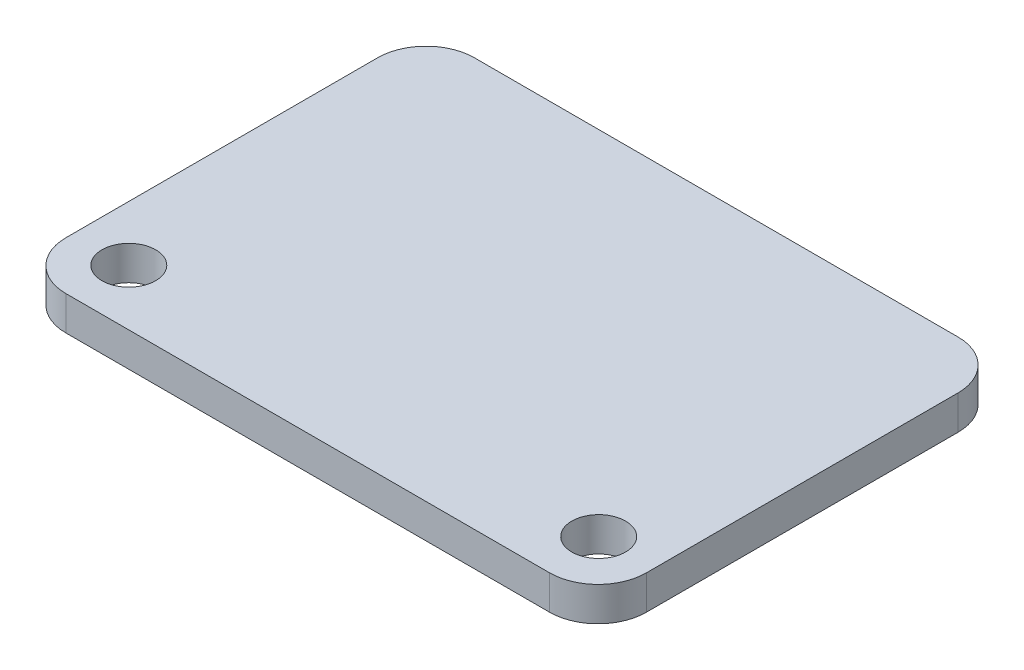
ISO-10303-21;
HEADER;
FILE_DESCRIPTION(('STEP AP214'),'2;1');
FILE_NAME('part.step','',(''),(''),'','','');
FILE_SCHEMA(('AUTOMOTIVE_DESIGN { 1 0 10303 214 1 1 1 1 }'));
ENDSEC;
DATA;
#1=APPLICATION_CONTEXT('core data for automotive mechanical design processes');
#2=APPLICATION_PROTOCOL_DEFINITION('international standard','automotive_design',2000,#1);
#3=PRODUCT_CONTEXT('',#1,'mechanical');
#4=PRODUCT('Part','Part','',(#3));
#5=PRODUCT_RELATED_PRODUCT_CATEGORY('part','',(#4));
#6=PRODUCT_DEFINITION_FORMATION('','',#4);
#7=PRODUCT_DEFINITION_CONTEXT('part definition',#1,'design');
#8=PRODUCT_DEFINITION('design','',#6,#7);
#9=PRODUCT_DEFINITION_SHAPE('','',#8);
#10=(LENGTH_UNIT() NAMED_UNIT(*) SI_UNIT(.MILLI.,.METRE.));
#11=(NAMED_UNIT(*) PLANE_ANGLE_UNIT() SI_UNIT($,.RADIAN.));
#12=(NAMED_UNIT(*) SI_UNIT($,.STERADIAN.) SOLID_ANGLE_UNIT());
#13=UNCERTAINTY_MEASURE_WITH_UNIT(LENGTH_MEASURE(1.E-05),#10,'distance_accuracy_value','');
#14=(GEOMETRIC_REPRESENTATION_CONTEXT(3) GLOBAL_UNCERTAINTY_ASSIGNED_CONTEXT((#13)) GLOBAL_UNIT_ASSIGNED_CONTEXT((#10,
#11,#12)) REPRESENTATION_CONTEXT('',''));
#15=CARTESIAN_POINT('',(0.,0.,0.));
#16=DIRECTION('',(0.,0.,1.));
#17=DIRECTION('',(1.,0.,0.));
#18=AXIS2_PLACEMENT_3D('',#15,#16,#17);
#19=CARTESIAN_POINT('',(13.5,1.5875,9.5));
#20=DIRECTION('',(-1.,0.,0.));
#21=DIRECTION('',(0.,0.,1.));
#22=AXIS2_PLACEMENT_3D('',#19,#20,#21);
#23=PLANE('',#22);
#24=DIRECTION('',(0.,0.,-1.));
#25=VECTOR('',#24,1.);
#26=CARTESIAN_POINT('',(13.5,1.5875,9.5));
#27=LINE('',#26,#25);
#28=CARTESIAN_POINT('',(13.5,1.5875,7.25));
#29=VERTEX_POINT('',#28);
#30=CARTESIAN_POINT('',(13.5,1.5875,-7.25));
#31=VERTEX_POINT('',#30);
#32=EDGE_CURVE('E127',#29,#31,#27,.T.);
#33=ORIENTED_EDGE('',*,*,#32,.F.);
#34=DIRECTION('',(0.,-1.,0.));
#35=VECTOR('',#34,1.);
#36=CARTESIAN_POINT('',(13.5,1.5875,7.25));
#37=LINE('',#36,#35);
#38=CARTESIAN_POINT('',(13.5,0.,7.25));
#39=VERTEX_POINT('',#38);
#40=EDGE_CURVE('E153',#29,#39,#37,.T.);
#41=ORIENTED_EDGE('',*,*,#40,.T.);
#42=DIRECTION('',(0.,0.,-1.));
#43=VECTOR('',#42,1.);
#44=CARTESIAN_POINT('',(13.5,0.,9.5));
#45=LINE('',#44,#43);
#46=CARTESIAN_POINT('',(13.5,0.,-7.25));
#47=VERTEX_POINT('',#46);
#48=EDGE_CURVE('E159',#39,#47,#45,.T.);
#49=ORIENTED_EDGE('',*,*,#48,.T.);
#50=DIRECTION('',(0.,-1.,0.));
#51=VECTOR('',#50,1.);
#52=CARTESIAN_POINT('',(13.5,1.5875,-7.25));
#53=LINE('',#52,#51);
#54=EDGE_CURVE('E151',#47,#31,#53,.F.);
#55=ORIENTED_EDGE('',*,*,#54,.T.);
#56=EDGE_LOOP('',(#33,#41,#49,#55));
#57=FACE_BOUND('',#56,.T.);
#58=ADVANCED_FACE('F35',(#57),#23,.F.);
#59=CARTESIAN_POINT('',(-13.5,1.5875,-9.5));
#60=DIRECTION('',(0.,0.,1.));
#61=DIRECTION('',(1.,0.,0.));
#62=AXIS2_PLACEMENT_3D('',#59,#60,#61);
#63=PLANE('',#62);
#64=DIRECTION('',(-1.,0.,0.));
#65=VECTOR('',#64,1.);
#66=CARTESIAN_POINT('',(-13.5,1.5875,-9.5));
#67=LINE('',#66,#65);
#68=CARTESIAN_POINT('',(11.25,1.5875,-9.5));
#69=VERTEX_POINT('',#68);
#70=CARTESIAN_POINT('',(-11.25,1.5875,-9.5));
#71=VERTEX_POINT('',#70);
#72=EDGE_CURVE('E130',#69,#71,#67,.T.);
#73=ORIENTED_EDGE('',*,*,#72,.F.);
#74=DIRECTION('',(0.,-1.,0.));
#75=VECTOR('',#74,1.);
#76=CARTESIAN_POINT('',(11.25,1.5875,-9.5));
#77=LINE('',#76,#75);
#78=CARTESIAN_POINT('',(11.25,0.,-9.5));
#79=VERTEX_POINT('',#78);
#80=EDGE_CURVE('E11',#69,#79,#77,.T.);
#81=ORIENTED_EDGE('',*,*,#80,.T.);
#82=DIRECTION('',(-1.,0.,0.));
#83=VECTOR('',#82,1.);
#84=CARTESIAN_POINT('',(-13.5,0.,-9.5));
#85=LINE('',#84,#83);
#86=CARTESIAN_POINT('',(-11.25,0.,-9.5));
#87=VERTEX_POINT('',#86);
#88=EDGE_CURVE('E132',#79,#87,#85,.T.);
#89=ORIENTED_EDGE('',*,*,#88,.T.);
#90=DIRECTION('',(0.,-1.,0.));
#91=VECTOR('',#90,1.);
#92=CARTESIAN_POINT('',(-11.25,1.5875,-9.5));
#93=LINE('',#92,#91);
#94=EDGE_CURVE('E43',#87,#71,#93,.F.);
#95=ORIENTED_EDGE('',*,*,#94,.T.);
#96=EDGE_LOOP('',(#73,#81,#89,#95));
#97=FACE_BOUND('',#96,.T.);
#98=ADVANCED_FACE('F204',(#97),#63,.F.);
#99=CARTESIAN_POINT('',(-13.5,1.5875,9.5));
#100=DIRECTION('',(1.,0.,0.));
#101=DIRECTION('',(0.,0.,-1.));
#102=AXIS2_PLACEMENT_3D('',#99,#100,#101);
#103=PLANE('',#102);
#104=DIRECTION('',(0.,0.,1.));
#105=VECTOR('',#104,1.);
#106=CARTESIAN_POINT('',(-13.5,0.,9.5));
#107=LINE('',#106,#105);
#108=CARTESIAN_POINT('',(-13.5,0.,-7.25));
#109=VERTEX_POINT('',#108);
#110=CARTESIAN_POINT('',(-13.5,0.,7.25));
#111=VERTEX_POINT('',#110);
#112=EDGE_CURVE('E128',#109,#111,#107,.T.);
#113=ORIENTED_EDGE('',*,*,#112,.T.);
#114=DIRECTION('',(0.,-1.,0.));
#115=VECTOR('',#114,1.);
#116=CARTESIAN_POINT('',(-13.5,1.5875,7.25));
#117=LINE('',#116,#115);
#118=CARTESIAN_POINT('',(-13.5,1.5875,7.25));
#119=VERTEX_POINT('',#118);
#120=EDGE_CURVE('E106',#111,#119,#117,.F.);
#121=ORIENTED_EDGE('',*,*,#120,.T.);
#122=DIRECTION('',(0.,0.,1.));
#123=VECTOR('',#122,1.);
#124=CARTESIAN_POINT('',(-13.5,1.5875,9.5));
#125=LINE('',#124,#123);
#126=CARTESIAN_POINT('',(-13.5,1.5875,-7.25));
#127=VERTEX_POINT('',#126);
#128=EDGE_CURVE('E171',#127,#119,#125,.T.);
#129=ORIENTED_EDGE('',*,*,#128,.F.);
#130=DIRECTION('',(0.,-1.,0.));
#131=VECTOR('',#130,1.);
#132=CARTESIAN_POINT('',(-13.5,1.5875,-7.25));
#133=LINE('',#132,#131);
#134=EDGE_CURVE('E111',#127,#109,#133,.T.);
#135=ORIENTED_EDGE('',*,*,#134,.T.);
#136=EDGE_LOOP('',(#113,#121,#129,#135));
#137=FACE_BOUND('',#136,.T.);
#138=ADVANCED_FACE('F202',(#137),#103,.F.);
#139=CARTESIAN_POINT('',(-13.5,1.5875,9.5));
#140=DIRECTION('',(0.,0.,-1.));
#141=DIRECTION('',(-1.,0.,0.));
#142=AXIS2_PLACEMENT_3D('',#139,#140,#141);
#143=PLANE('',#142);
#144=DIRECTION('',(1.,0.,0.));
#145=VECTOR('',#144,1.);
#146=CARTESIAN_POINT('',(-13.5,1.5875,9.5));
#147=LINE('',#146,#145);
#148=CARTESIAN_POINT('',(-11.25,1.5875,9.5));
#149=VERTEX_POINT('',#148);
#150=CARTESIAN_POINT('',(11.25,1.5875,9.5));
#151=VERTEX_POINT('',#150);
#152=EDGE_CURVE('E121',#149,#151,#147,.T.);
#153=ORIENTED_EDGE('',*,*,#152,.F.);
#154=DIRECTION('',(0.,-1.,0.));
#155=VECTOR('',#154,1.);
#156=CARTESIAN_POINT('',(-11.25,1.5875,9.5));
#157=LINE('',#156,#155);
#158=CARTESIAN_POINT('',(-11.25,0.,9.5));
#159=VERTEX_POINT('',#158);
#160=EDGE_CURVE('E105',#149,#159,#157,.T.);
#161=ORIENTED_EDGE('',*,*,#160,.T.);
#162=DIRECTION('',(1.,0.,0.));
#163=VECTOR('',#162,1.);
#164=CARTESIAN_POINT('',(-13.5,0.,9.5));
#165=LINE('',#164,#163);
#166=CARTESIAN_POINT('',(11.25,0.,9.5));
#167=VERTEX_POINT('',#166);
#168=EDGE_CURVE('E118',#159,#167,#165,.T.);
#169=ORIENTED_EDGE('',*,*,#168,.T.);
#170=DIRECTION('',(0.,-1.,0.));
#171=VECTOR('',#170,1.);
#172=CARTESIAN_POINT('',(11.25,1.5875,9.5));
#173=LINE('',#172,#171);
#174=EDGE_CURVE('E123',#167,#151,#173,.F.);
#175=ORIENTED_EDGE('',*,*,#174,.T.);
#176=EDGE_LOOP('',(#153,#161,#169,#175));
#177=FACE_BOUND('',#176,.T.);
#178=ADVANCED_FACE('F117',(#177),#143,.F.);
#179=CARTESIAN_POINT('',(0.,1.5875,0.));
#180=DIRECTION('',(0.,-1.,0.));
#181=DIRECTION('',(0.,0.,-1.));
#182=AXIS2_PLACEMENT_3D('',#179,#180,#181);
#183=PLANE('',#182);
#184=CARTESIAN_POINT('',(10.9290366369435,1.5875,6.89606102994959));
#185=DIRECTION('',(0.,1.,0.));
#186=DIRECTION('',(0.,0.,1.));
#187=AXIS2_PLACEMENT_3D('',#184,#185,#186);
#188=CIRCLE('',#187,1.25);
#189=CARTESIAN_POINT('',(10.9290366369435,1.5875,8.14606102994959));
#190=VERTEX_POINT('',#189);
#191=EDGE_CURVE('E178',#190,#190,#188,.T.);
#192=ORIENTED_EDGE('',*,*,#191,.F.);
#193=EDGE_LOOP('',(#192));
#194=FACE_BOUND('',#193,.T.);
#195=CARTESIAN_POINT('',(-10.9290366369435,1.5875,6.89606102994959));
#196=DIRECTION('',(0.,1.,0.));
#197=DIRECTION('',(0.,0.,1.));
#198=AXIS2_PLACEMENT_3D('',#195,#196,#197);
#199=CIRCLE('',#198,1.25);
#200=CARTESIAN_POINT('',(-10.9290366369435,1.5875,8.14606102994959));
#201=VERTEX_POINT('',#200);
#202=EDGE_CURVE('E167',#201,#201,#199,.T.);
#203=ORIENTED_EDGE('',*,*,#202,.F.);
#204=EDGE_LOOP('',(#203));
#205=FACE_BOUND('',#204,.T.);
#206=ORIENTED_EDGE('',*,*,#128,.T.);
#207=CARTESIAN_POINT('',(-11.25,1.5875,7.25));
#208=DIRECTION('',(0.,-1.,0.));
#209=DIRECTION('',(0.,0.,-1.));
#210=AXIS2_PLACEMENT_3D('',#207,#208,#209);
#211=CIRCLE('',#210,2.25);
#212=EDGE_CURVE('E149',#119,#149,#211,.F.);
#213=ORIENTED_EDGE('',*,*,#212,.T.);
#214=ORIENTED_EDGE('',*,*,#152,.T.);
#215=CARTESIAN_POINT('',(11.25,1.5875,7.25));
#216=DIRECTION('',(0.,-1.,0.));
#217=DIRECTION('',(0.,0.,-1.));
#218=AXIS2_PLACEMENT_3D('',#215,#216,#217);
#219=CIRCLE('',#218,2.25);
#220=EDGE_CURVE('E147',#151,#29,#219,.F.);
#221=ORIENTED_EDGE('',*,*,#220,.T.);
#222=ORIENTED_EDGE('',*,*,#32,.T.);
#223=CARTESIAN_POINT('',(11.25,1.5875,-7.25));
#224=DIRECTION('',(0.,-1.,0.));
#225=DIRECTION('',(0.,0.,-1.));
#226=AXIS2_PLACEMENT_3D('',#223,#224,#225);
#227=CIRCLE('',#226,2.25);
#228=EDGE_CURVE('E56',#31,#69,#227,.F.);
#229=ORIENTED_EDGE('',*,*,#228,.T.);
#230=ORIENTED_EDGE('',*,*,#72,.T.);
#231=CARTESIAN_POINT('',(-11.25,1.5875,-7.25));
#232=DIRECTION('',(0.,-1.,0.));
#233=DIRECTION('',(0.,0.,-1.));
#234=AXIS2_PLACEMENT_3D('',#231,#232,#233);
#235=CIRCLE('',#234,2.25);
#236=EDGE_CURVE('E144',#71,#127,#235,.F.);
#237=ORIENTED_EDGE('',*,*,#236,.T.);
#238=EDGE_LOOP('',(#206,#213,#214,#221,#222,#229,#230,#237));
#239=FACE_BOUND('',#238,.T.);
#240=ADVANCED_FACE('F193',(#194,#205,#239),#183,.F.);
#241=CARTESIAN_POINT('',(0.,0.,0.));
#242=DIRECTION('',(0.,-1.,0.));
#243=DIRECTION('',(0.,0.,-1.));
#244=AXIS2_PLACEMENT_3D('',#241,#242,#243);
#245=PLANE('',#244);
#246=CARTESIAN_POINT('',(10.9290366369435,0.,6.89606102994959));
#247=DIRECTION('',(0.,1.,0.));
#248=DIRECTION('',(0.,0.,1.));
#249=AXIS2_PLACEMENT_3D('',#246,#247,#248);
#250=CIRCLE('',#249,1.25);
#251=CARTESIAN_POINT('',(10.9290366369435,0.,8.14606102994959));
#252=VERTEX_POINT('',#251);
#253=EDGE_CURVE('E176',#252,#252,#250,.T.);
#254=ORIENTED_EDGE('',*,*,#253,.T.);
#255=EDGE_LOOP('',(#254));
#256=FACE_BOUND('',#255,.T.);
#257=CARTESIAN_POINT('',(-10.9290366369435,0.,6.89606102994959));
#258=DIRECTION('',(0.,1.,0.));
#259=DIRECTION('',(0.,0.,1.));
#260=AXIS2_PLACEMENT_3D('',#257,#258,#259);
#261=CIRCLE('',#260,1.25);
#262=CARTESIAN_POINT('',(-10.9290366369435,0.,8.14606102994959));
#263=VERTEX_POINT('',#262);
#264=EDGE_CURVE('E164',#263,#263,#261,.T.);
#265=ORIENTED_EDGE('',*,*,#264,.T.);
#266=EDGE_LOOP('',(#265));
#267=FACE_BOUND('',#266,.T.);
#268=ORIENTED_EDGE('',*,*,#168,.F.);
#269=CARTESIAN_POINT('',(-11.25,0.,7.25));
#270=DIRECTION('',(0.,-1.,0.));
#271=DIRECTION('',(0.,0.,-1.));
#272=AXIS2_PLACEMENT_3D('',#269,#270,#271);
#273=CIRCLE('',#272,2.25);
#274=EDGE_CURVE('E101',#159,#111,#273,.T.);
#275=ORIENTED_EDGE('',*,*,#274,.T.);
#276=ORIENTED_EDGE('',*,*,#112,.F.);
#277=CARTESIAN_POINT('',(-11.25,0.,-7.25));
#278=DIRECTION('',(0.,-1.,0.));
#279=DIRECTION('',(0.,0.,-1.));
#280=AXIS2_PLACEMENT_3D('',#277,#278,#279);
#281=CIRCLE('',#280,2.25);
#282=EDGE_CURVE('E122',#109,#87,#281,.T.);
#283=ORIENTED_EDGE('',*,*,#282,.T.);
#284=ORIENTED_EDGE('',*,*,#88,.F.);
#285=CARTESIAN_POINT('',(11.25,0.,-7.25));
#286=DIRECTION('',(0.,-1.,0.));
#287=DIRECTION('',(0.,0.,-1.));
#288=AXIS2_PLACEMENT_3D('',#285,#286,#287);
#289=CIRCLE('',#288,2.25);
#290=EDGE_CURVE('E138',#79,#47,#289,.T.);
#291=ORIENTED_EDGE('',*,*,#290,.T.);
#292=ORIENTED_EDGE('',*,*,#48,.F.);
#293=CARTESIAN_POINT('',(11.25,0.,7.25));
#294=DIRECTION('',(0.,-1.,0.));
#295=DIRECTION('',(0.,0.,-1.));
#296=AXIS2_PLACEMENT_3D('',#293,#294,#295);
#297=CIRCLE('',#296,2.25);
#298=EDGE_CURVE('E112',#39,#167,#297,.T.);
#299=ORIENTED_EDGE('',*,*,#298,.T.);
#300=EDGE_LOOP('',(#268,#275,#276,#283,#284,#291,#292,#299));
#301=FACE_BOUND('',#300,.T.);
#302=ADVANCED_FACE('F125',(#256,#267,#301),#245,.T.);
#303=CARTESIAN_POINT('',(-11.25,1.5875,7.25));
#304=DIRECTION('',(0.,-1.,0.));
#305=DIRECTION('',(0.,0.,-1.));
#306=AXIS2_PLACEMENT_3D('',#303,#304,#305);
#307=CYLINDRICAL_SURFACE('',#306,2.25);
#308=ORIENTED_EDGE('',*,*,#212,.F.);
#309=ORIENTED_EDGE('',*,*,#120,.F.);
#310=ORIENTED_EDGE('',*,*,#274,.F.);
#311=ORIENTED_EDGE('',*,*,#160,.F.);
#312=EDGE_LOOP('',(#308,#309,#310,#311));
#313=FACE_BOUND('',#312,.T.);
#314=ADVANCED_FACE('F104',(#313),#307,.T.);
#315=CARTESIAN_POINT('',(11.25,1.5875,7.25));
#316=DIRECTION('',(0.,-1.,0.));
#317=DIRECTION('',(0.,0.,-1.));
#318=AXIS2_PLACEMENT_3D('',#315,#316,#317);
#319=CYLINDRICAL_SURFACE('',#318,2.25);
#320=ORIENTED_EDGE('',*,*,#220,.F.);
#321=ORIENTED_EDGE('',*,*,#174,.F.);
#322=ORIENTED_EDGE('',*,*,#298,.F.);
#323=ORIENTED_EDGE('',*,*,#40,.F.);
#324=EDGE_LOOP('',(#320,#321,#322,#323));
#325=FACE_BOUND('',#324,.T.);
#326=ADVANCED_FACE('F208',(#325),#319,.T.);
#327=CARTESIAN_POINT('',(11.25,1.5875,-7.25));
#328=DIRECTION('',(0.,-1.,0.));
#329=DIRECTION('',(0.,0.,-1.));
#330=AXIS2_PLACEMENT_3D('',#327,#328,#329);
#331=CYLINDRICAL_SURFACE('',#330,2.25);
#332=ORIENTED_EDGE('',*,*,#228,.F.);
#333=ORIENTED_EDGE('',*,*,#54,.F.);
#334=ORIENTED_EDGE('',*,*,#290,.F.);
#335=ORIENTED_EDGE('',*,*,#80,.F.);
#336=EDGE_LOOP('',(#332,#333,#334,#335));
#337=FACE_BOUND('',#336,.T.);
#338=ADVANCED_FACE('F207',(#337),#331,.T.);
#339=CARTESIAN_POINT('',(-11.25,1.5875,-7.25));
#340=DIRECTION('',(0.,-1.,0.));
#341=DIRECTION('',(0.,0.,-1.));
#342=AXIS2_PLACEMENT_3D('',#339,#340,#341);
#343=CYLINDRICAL_SURFACE('',#342,2.25);
#344=ORIENTED_EDGE('',*,*,#236,.F.);
#345=ORIENTED_EDGE('',*,*,#94,.F.);
#346=ORIENTED_EDGE('',*,*,#282,.F.);
#347=ORIENTED_EDGE('',*,*,#134,.F.);
#348=EDGE_LOOP('',(#344,#345,#346,#347));
#349=FACE_BOUND('',#348,.T.);
#350=ADVANCED_FACE('F37',(#349),#343,.T.);
#351=CARTESIAN_POINT('',(-10.9290366369435,0.,6.89606102994959));
#352=DIRECTION('',(0.,1.,0.));
#353=DIRECTION('',(0.,0.,1.));
#354=AXIS2_PLACEMENT_3D('',#351,#352,#353);
#355=CYLINDRICAL_SURFACE('',#354,1.25);
#356=ORIENTED_EDGE('',*,*,#264,.F.);
#357=EDGE_LOOP('',(#356));
#358=FACE_BOUND('',#357,.T.);
#359=ORIENTED_EDGE('',*,*,#202,.T.);
#360=EDGE_LOOP('',(#359));
#361=FACE_BOUND('',#360,.T.);
#362=ADVANCED_FACE('F189',(#358,#361),#355,.F.);
#363=CARTESIAN_POINT('',(10.9290366369435,0.,6.89606102994959));
#364=DIRECTION('',(0.,1.,0.));
#365=DIRECTION('',(0.,0.,1.));
#366=AXIS2_PLACEMENT_3D('',#363,#364,#365);
#367=CYLINDRICAL_SURFACE('',#366,1.25);
#368=ORIENTED_EDGE('',*,*,#253,.F.);
#369=EDGE_LOOP('',(#368));
#370=FACE_BOUND('',#369,.T.);
#371=ORIENTED_EDGE('',*,*,#191,.T.);
#372=EDGE_LOOP('',(#371));
#373=FACE_BOUND('',#372,.T.);
#374=ADVANCED_FACE('F186',(#370,#373),#367,.F.);
#375=CLOSED_SHELL('',(#58,#98,#138,#178,#240,#302,#314,#326,#338,#350,#362,#374));
#376=MANIFOLD_SOLID_BREP('B2',#375);
#377=ADVANCED_BREP_SHAPE_REPRESENTATION('',(#18,#376),#14);
#378=SHAPE_DEFINITION_REPRESENTATION(#9,#377);
ENDSEC;
END-ISO-10303-21;
